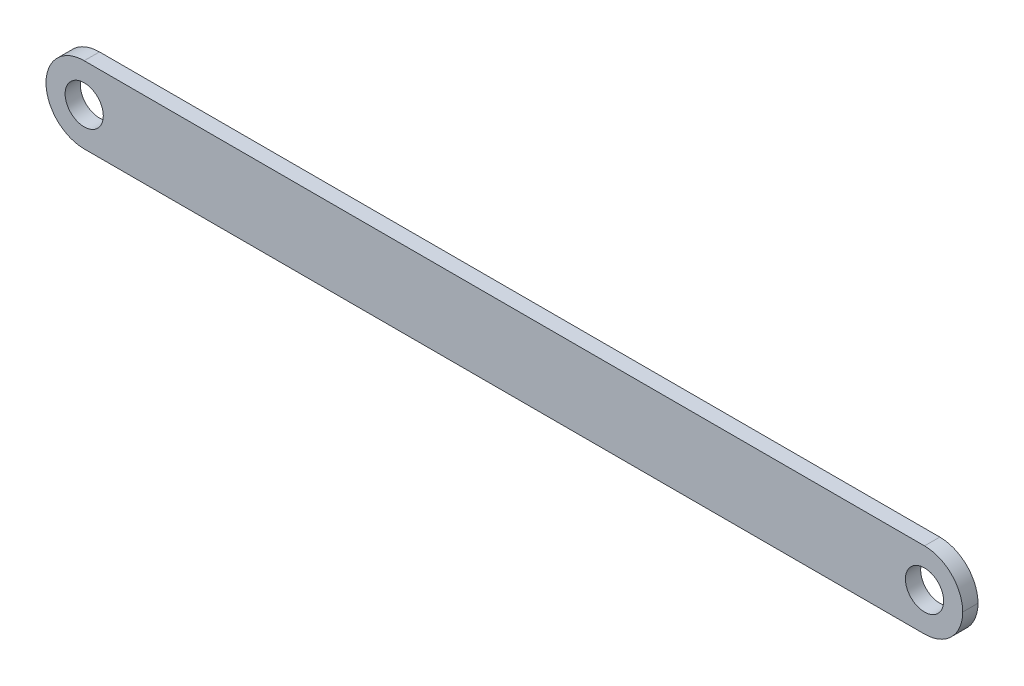
ISO-10303-21;
HEADER;
FILE_DESCRIPTION(('STEP AP214'),'2;1');
FILE_NAME('part.step','',(''),(''),'','','');
FILE_SCHEMA(('AUTOMOTIVE_DESIGN { 1 0 10303 214 1 1 1 1 }'));
ENDSEC;
DATA;
#1=APPLICATION_CONTEXT('core data for automotive mechanical design processes');
#2=APPLICATION_PROTOCOL_DEFINITION('international standard','automotive_design',2000,#1);
#3=PRODUCT_CONTEXT('',#1,'mechanical');
#4=PRODUCT('Part','Part','',(#3));
#5=PRODUCT_RELATED_PRODUCT_CATEGORY('part','',(#4));
#6=PRODUCT_DEFINITION_FORMATION('','',#4);
#7=PRODUCT_DEFINITION_CONTEXT('part definition',#1,'design');
#8=PRODUCT_DEFINITION('design','',#6,#7);
#9=PRODUCT_DEFINITION_SHAPE('','',#8);
#10=(LENGTH_UNIT() NAMED_UNIT(*) SI_UNIT(.MILLI.,.METRE.));
#11=(NAMED_UNIT(*) PLANE_ANGLE_UNIT() SI_UNIT($,.RADIAN.));
#12=(NAMED_UNIT(*) SI_UNIT($,.STERADIAN.) SOLID_ANGLE_UNIT());
#13=UNCERTAINTY_MEASURE_WITH_UNIT(LENGTH_MEASURE(1.E-05),#10,'distance_accuracy_value','');
#14=(GEOMETRIC_REPRESENTATION_CONTEXT(3) GLOBAL_UNCERTAINTY_ASSIGNED_CONTEXT((#13)) GLOBAL_UNIT_ASSIGNED_CONTEXT((#10,
#11,#12)) REPRESENTATION_CONTEXT('',''));
#15=CARTESIAN_POINT('',(0.,0.,0.));
#16=DIRECTION('',(0.,0.,1.));
#17=DIRECTION('',(1.,0.,0.));
#18=AXIS2_PLACEMENT_3D('',#15,#16,#17);
#19=CARTESIAN_POINT('',(0.,0.,2.54));
#20=DIRECTION('',(0.,0.,-1.));
#21=DIRECTION('',(-1.,0.,0.));
#22=AXIS2_PLACEMENT_3D('',#19,#20,#21);
#23=PLANE('',#22);
#24=DIRECTION('',(1.,0.,0.));
#25=VECTOR('',#24,1.);
#26=CARTESIAN_POINT('',(0.,0.,2.54));
#27=LINE('',#26,#25);
#28=CARTESIAN_POINT('',(6.35,0.,2.54));
#29=VERTEX_POINT('',#28);
#30=CARTESIAN_POINT('',(146.05,0.,2.54));
#31=VERTEX_POINT('',#30);
#32=EDGE_CURVE('E118',#29,#31,#27,.T.);
#33=ORIENTED_EDGE('',*,*,#32,.T.);
#34=CARTESIAN_POINT('',(146.05,6.35,2.54));
#35=DIRECTION('',(0.,0.,-1.));
#36=DIRECTION('',(-1.,0.,0.));
#37=AXIS2_PLACEMENT_3D('',#34,#35,#36);
#38=CIRCLE('',#37,6.35);
#39=CARTESIAN_POINT('',(152.4,6.35,2.54));
#40=VERTEX_POINT('',#39);
#41=EDGE_CURVE('E55',#31,#40,#38,.F.);
#42=ORIENTED_EDGE('',*,*,#41,.T.);
#43=CARTESIAN_POINT('',(146.05,6.35,2.54));
#44=DIRECTION('',(0.,0.,-1.));
#45=DIRECTION('',(-1.,0.,0.));
#46=AXIS2_PLACEMENT_3D('',#43,#44,#45);
#47=CIRCLE('',#46,6.35);
#48=CARTESIAN_POINT('',(146.05,12.7,2.54));
#49=VERTEX_POINT('',#48);
#50=EDGE_CURVE('E62',#40,#49,#47,.F.);
#51=ORIENTED_EDGE('',*,*,#50,.T.);
#52=DIRECTION('',(-1.,0.,0.));
#53=VECTOR('',#52,1.);
#54=CARTESIAN_POINT('',(0.,12.7,2.54));
#55=LINE('',#54,#53);
#56=CARTESIAN_POINT('',(6.35,12.7,2.54));
#57=VERTEX_POINT('',#56);
#58=EDGE_CURVE('E120',#49,#57,#55,.T.);
#59=ORIENTED_EDGE('',*,*,#58,.T.);
#60=CARTESIAN_POINT('',(6.35,6.35,2.54));
#61=DIRECTION('',(0.,0.,-1.));
#62=DIRECTION('',(-1.,0.,0.));
#63=AXIS2_PLACEMENT_3D('',#60,#61,#62);
#64=CIRCLE('',#63,6.35);
#65=CARTESIAN_POINT('',(0.,6.35,2.54));
#66=VERTEX_POINT('',#65);
#67=EDGE_CURVE('E108',#57,#66,#64,.F.);
#68=ORIENTED_EDGE('',*,*,#67,.T.);
#69=CARTESIAN_POINT('',(6.35,6.35,2.54));
#70=DIRECTION('',(0.,0.,-1.));
#71=DIRECTION('',(-1.,0.,0.));
#72=AXIS2_PLACEMENT_3D('',#69,#70,#71);
#73=CIRCLE('',#72,6.35);
#74=EDGE_CURVE('E143',#66,#29,#73,.F.);
#75=ORIENTED_EDGE('',*,*,#74,.T.);
#76=EDGE_LOOP('',(#33,#42,#51,#59,#68,#75));
#77=FACE_BOUND('',#76,.T.);
#78=CARTESIAN_POINT('',(6.35,6.35,2.54));
#79=DIRECTION('',(0.,0.,1.));
#80=DIRECTION('',(1.,0.,0.));
#81=AXIS2_PLACEMENT_3D('',#78,#79,#80);
#82=CIRCLE('',#81,3.175);
#83=CARTESIAN_POINT('',(9.525,6.35,2.54));
#84=VERTEX_POINT('',#83);
#85=EDGE_CURVE('E128',#84,#84,#82,.T.);
#86=ORIENTED_EDGE('',*,*,#85,.F.);
#87=EDGE_LOOP('',(#86));
#88=FACE_BOUND('',#87,.T.);
#89=CARTESIAN_POINT('',(146.05,6.35,2.54));
#90=DIRECTION('',(0.,0.,1.));
#91=DIRECTION('',(1.,0.,0.));
#92=AXIS2_PLACEMENT_3D('',#89,#90,#91);
#93=CIRCLE('',#92,3.175);
#94=CARTESIAN_POINT('',(149.225,6.35,2.54));
#95=VERTEX_POINT('',#94);
#96=EDGE_CURVE('E169',#95,#95,#93,.T.);
#97=ORIENTED_EDGE('',*,*,#96,.F.);
#98=EDGE_LOOP('',(#97));
#99=FACE_BOUND('',#98,.T.);
#100=ADVANCED_FACE('F45',(#77,#88,#99),#23,.F.);
#101=CARTESIAN_POINT('',(0.,0.,0.));
#102=DIRECTION('',(0.,0.,-1.));
#103=DIRECTION('',(-1.,0.,0.));
#104=AXIS2_PLACEMENT_3D('',#101,#102,#103);
#105=PLANE('',#104);
#106=CARTESIAN_POINT('',(6.35,6.35,0.));
#107=DIRECTION('',(0.,0.,1.));
#108=DIRECTION('',(1.,0.,0.));
#109=AXIS2_PLACEMENT_3D('',#106,#107,#108);
#110=CIRCLE('',#109,3.175);
#111=CARTESIAN_POINT('',(9.525,6.35,0.));
#112=VERTEX_POINT('',#111);
#113=EDGE_CURVE('E134',#112,#112,#110,.T.);
#114=ORIENTED_EDGE('',*,*,#113,.T.);
#115=EDGE_LOOP('',(#114));
#116=FACE_BOUND('',#115,.T.);
#117=CARTESIAN_POINT('',(146.05,6.35,0.));
#118=DIRECTION('',(0.,0.,-1.));
#119=DIRECTION('',(-1.,0.,0.));
#120=AXIS2_PLACEMENT_3D('',#117,#118,#119);
#121=CIRCLE('',#120,6.35);
#122=CARTESIAN_POINT('',(146.05,12.7,0.));
#123=VERTEX_POINT('',#122);
#124=CARTESIAN_POINT('',(152.4,6.35,0.));
#125=VERTEX_POINT('',#124);
#126=EDGE_CURVE('E150',#123,#125,#121,.T.);
#127=ORIENTED_EDGE('',*,*,#126,.T.);
#128=CARTESIAN_POINT('',(146.05,6.35,0.));
#129=DIRECTION('',(0.,0.,-1.));
#130=DIRECTION('',(-1.,0.,0.));
#131=AXIS2_PLACEMENT_3D('',#128,#129,#130);
#132=CIRCLE('',#131,6.35);
#133=CARTESIAN_POINT('',(146.05,0.,0.));
#134=VERTEX_POINT('',#133);
#135=EDGE_CURVE('E125',#125,#134,#132,.T.);
#136=ORIENTED_EDGE('',*,*,#135,.T.);
#137=DIRECTION('',(1.,0.,0.));
#138=VECTOR('',#137,1.);
#139=CARTESIAN_POINT('',(0.,0.,0.));
#140=LINE('',#139,#138);
#141=CARTESIAN_POINT('',(6.35,0.,0.));
#142=VERTEX_POINT('',#141);
#143=EDGE_CURVE('E116',#142,#134,#140,.T.);
#144=ORIENTED_EDGE('',*,*,#143,.F.);
#145=CARTESIAN_POINT('',(6.35,6.35,0.));
#146=DIRECTION('',(0.,0.,-1.));
#147=DIRECTION('',(-1.,0.,0.));
#148=AXIS2_PLACEMENT_3D('',#145,#146,#147);
#149=CIRCLE('',#148,6.35);
#150=CARTESIAN_POINT('',(0.,6.35,0.));
#151=VERTEX_POINT('',#150);
#152=EDGE_CURVE('E96',#142,#151,#149,.T.);
#153=ORIENTED_EDGE('',*,*,#152,.T.);
#154=CARTESIAN_POINT('',(6.35,6.35,0.));
#155=DIRECTION('',(0.,0.,-1.));
#156=DIRECTION('',(-1.,0.,0.));
#157=AXIS2_PLACEMENT_3D('',#154,#155,#156);
#158=CIRCLE('',#157,6.35);
#159=CARTESIAN_POINT('',(6.35,12.7,0.));
#160=VERTEX_POINT('',#159);
#161=EDGE_CURVE('E109',#151,#160,#158,.T.);
#162=ORIENTED_EDGE('',*,*,#161,.T.);
#163=DIRECTION('',(-1.,0.,0.));
#164=VECTOR('',#163,1.);
#165=CARTESIAN_POINT('',(0.,12.7,0.));
#166=LINE('',#165,#164);
#167=EDGE_CURVE('E127',#123,#160,#166,.T.);
#168=ORIENTED_EDGE('',*,*,#167,.F.);
#169=EDGE_LOOP('',(#127,#136,#144,#153,#162,#168));
#170=FACE_BOUND('',#169,.T.);
#171=CARTESIAN_POINT('',(146.05,6.35,0.));
#172=DIRECTION('',(0.,0.,1.));
#173=DIRECTION('',(1.,0.,0.));
#174=AXIS2_PLACEMENT_3D('',#171,#172,#173);
#175=CIRCLE('',#174,3.175);
#176=CARTESIAN_POINT('',(149.225,6.35,0.));
#177=VERTEX_POINT('',#176);
#178=EDGE_CURVE('E153',#177,#177,#175,.T.);
#179=ORIENTED_EDGE('',*,*,#178,.T.);
#180=EDGE_LOOP('',(#179));
#181=FACE_BOUND('',#180,.T.);
#182=ADVANCED_FACE('F122',(#116,#170,#181),#105,.T.);
#183=CARTESIAN_POINT('',(0.,0.,2.54));
#184=DIRECTION('',(0.,1.,0.));
#185=DIRECTION('',(0.,0.,1.));
#186=AXIS2_PLACEMENT_3D('',#183,#184,#185);
#187=PLANE('',#186);
#188=ORIENTED_EDGE('',*,*,#143,.T.);
#189=DIRECTION('',(0.,0.,-1.));
#190=VECTOR('',#189,1.);
#191=CARTESIAN_POINT('',(146.05,0.,2.54));
#192=LINE('',#191,#190);
#193=EDGE_CURVE('E158',#134,#31,#192,.F.);
#194=ORIENTED_EDGE('',*,*,#193,.T.);
#195=ORIENTED_EDGE('',*,*,#32,.F.);
#196=DIRECTION('',(0.,0.,-1.));
#197=VECTOR('',#196,1.);
#198=CARTESIAN_POINT('',(6.35,0.,2.54));
#199=LINE('',#198,#197);
#200=EDGE_CURVE('E100',#29,#142,#199,.T.);
#201=ORIENTED_EDGE('',*,*,#200,.T.);
#202=EDGE_LOOP('',(#188,#194,#195,#201));
#203=FACE_BOUND('',#202,.T.);
#204=ADVANCED_FACE('F114',(#203),#187,.F.);
#205=CARTESIAN_POINT('',(0.,12.7,2.54));
#206=DIRECTION('',(0.,-1.,0.));
#207=DIRECTION('',(0.,0.,-1.));
#208=AXIS2_PLACEMENT_3D('',#205,#206,#207);
#209=PLANE('',#208);
#210=ORIENTED_EDGE('',*,*,#58,.F.);
#211=DIRECTION('',(0.,0.,-1.));
#212=VECTOR('',#211,1.);
#213=CARTESIAN_POINT('',(146.05,12.7,2.54));
#214=LINE('',#213,#212);
#215=EDGE_CURVE('E11',#49,#123,#214,.T.);
#216=ORIENTED_EDGE('',*,*,#215,.T.);
#217=ORIENTED_EDGE('',*,*,#167,.T.);
#218=DIRECTION('',(0.,0.,-1.));
#219=VECTOR('',#218,1.);
#220=CARTESIAN_POINT('',(6.35,12.7,2.54));
#221=LINE('',#220,#219);
#222=EDGE_CURVE('E146',#160,#57,#221,.F.);
#223=ORIENTED_EDGE('',*,*,#222,.T.);
#224=EDGE_LOOP('',(#210,#216,#217,#223));
#225=FACE_BOUND('',#224,.T.);
#226=ADVANCED_FACE('F194',(#225),#209,.F.);
#227=CARTESIAN_POINT('',(6.35,6.35,2.54));
#228=DIRECTION('',(0.,0.,-1.));
#229=DIRECTION('',(-1.,0.,0.));
#230=AXIS2_PLACEMENT_3D('',#227,#228,#229);
#231=CYLINDRICAL_SURFACE('',#230,3.175);
#232=ORIENTED_EDGE('',*,*,#85,.T.);
#233=EDGE_LOOP('',(#232));
#234=FACE_BOUND('',#233,.T.);
#235=ORIENTED_EDGE('',*,*,#113,.F.);
#236=EDGE_LOOP('',(#235));
#237=FACE_BOUND('',#236,.T.);
#238=ADVANCED_FACE('F191',(#234,#237),#231,.F.);
#239=CARTESIAN_POINT('',(146.05,6.35,2.54));
#240=DIRECTION('',(0.,0.,-1.));
#241=DIRECTION('',(-1.,0.,0.));
#242=AXIS2_PLACEMENT_3D('',#239,#240,#241);
#243=CYLINDRICAL_SURFACE('',#242,3.175);
#244=ORIENTED_EDGE('',*,*,#96,.T.);
#245=EDGE_LOOP('',(#244));
#246=FACE_BOUND('',#245,.T.);
#247=ORIENTED_EDGE('',*,*,#178,.F.);
#248=EDGE_LOOP('',(#247));
#249=FACE_BOUND('',#248,.T.);
#250=ADVANCED_FACE('F178',(#246,#249),#243,.F.);
#251=CARTESIAN_POINT('',(6.35,6.35,2.54));
#252=DIRECTION('',(0.,0.,-1.));
#253=DIRECTION('',(-1.,0.,0.));
#254=AXIS2_PLACEMENT_3D('',#251,#252,#253);
#255=CYLINDRICAL_SURFACE('',#254,6.35);
#256=DIRECTION('',(0.,0.,-1.));
#257=VECTOR('',#256,1.);
#258=CARTESIAN_POINT('',(0.,6.35,2.54));
#259=LINE('',#258,#257);
#260=EDGE_CURVE('E102',#66,#151,#259,.T.);
#261=ORIENTED_EDGE('',*,*,#260,.F.);
#262=ORIENTED_EDGE('',*,*,#67,.F.);
#263=ORIENTED_EDGE('',*,*,#222,.F.);
#264=ORIENTED_EDGE('',*,*,#161,.F.);
#265=EDGE_LOOP('',(#261,#262,#263,#264));
#266=FACE_BOUND('',#265,.T.);
#267=ADVANCED_FACE('F201',(#266),#255,.T.);
#268=CARTESIAN_POINT('',(6.35,6.35,2.54));
#269=DIRECTION('',(0.,0.,-1.));
#270=DIRECTION('',(-1.,0.,0.));
#271=AXIS2_PLACEMENT_3D('',#268,#269,#270);
#272=CYLINDRICAL_SURFACE('',#271,6.35);
#273=ORIENTED_EDGE('',*,*,#74,.F.);
#274=ORIENTED_EDGE('',*,*,#260,.T.);
#275=ORIENTED_EDGE('',*,*,#152,.F.);
#276=ORIENTED_EDGE('',*,*,#200,.F.);
#277=EDGE_LOOP('',(#273,#274,#275,#276));
#278=FACE_BOUND('',#277,.T.);
#279=ADVANCED_FACE('F99',(#278),#272,.T.);
#280=CARTESIAN_POINT('',(146.05,6.35,2.54));
#281=DIRECTION('',(0.,0.,-1.));
#282=DIRECTION('',(-1.,0.,0.));
#283=AXIS2_PLACEMENT_3D('',#280,#281,#282);
#284=CYLINDRICAL_SURFACE('',#283,6.35);
#285=ORIENTED_EDGE('',*,*,#215,.F.);
#286=ORIENTED_EDGE('',*,*,#50,.F.);
#287=DIRECTION('',(0.,0.,-1.));
#288=VECTOR('',#287,1.);
#289=CARTESIAN_POINT('',(152.4,6.35,2.54));
#290=LINE('',#289,#288);
#291=EDGE_CURVE('E49',#125,#40,#290,.F.);
#292=ORIENTED_EDGE('',*,*,#291,.F.);
#293=ORIENTED_EDGE('',*,*,#126,.F.);
#294=EDGE_LOOP('',(#285,#286,#292,#293));
#295=FACE_BOUND('',#294,.T.);
#296=ADVANCED_FACE('F47',(#295),#284,.T.);
#297=CARTESIAN_POINT('',(146.05,6.35,2.54));
#298=DIRECTION('',(0.,0.,-1.));
#299=DIRECTION('',(-1.,0.,0.));
#300=AXIS2_PLACEMENT_3D('',#297,#298,#299);
#301=CYLINDRICAL_SURFACE('',#300,6.35);
#302=ORIENTED_EDGE('',*,*,#41,.F.);
#303=ORIENTED_EDGE('',*,*,#193,.F.);
#304=ORIENTED_EDGE('',*,*,#135,.F.);
#305=ORIENTED_EDGE('',*,*,#291,.T.);
#306=EDGE_LOOP('',(#302,#303,#304,#305));
#307=FACE_BOUND('',#306,.T.);
#308=ADVANCED_FACE('F204',(#307),#301,.T.);
#309=CLOSED_SHELL('',(#100,#182,#204,#226,#238,#250,#267,#279,#296,#308));
#310=MANIFOLD_SOLID_BREP('B2',#309);
#311=ADVANCED_BREP_SHAPE_REPRESENTATION('',(#18,#310),#14);
#312=SHAPE_DEFINITION_REPRESENTATION(#9,#311);
ENDSEC;
END-ISO-10303-21;
